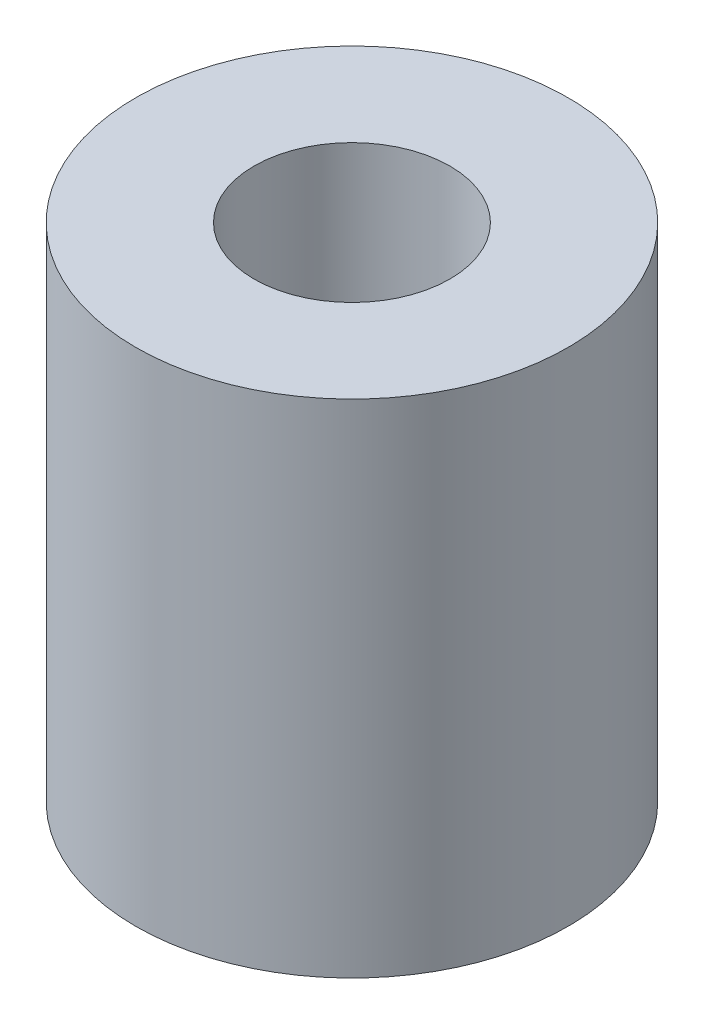
ISO-10303-21;
HEADER;
FILE_DESCRIPTION(('STEP AP214'),'2;1');
FILE_NAME('part.step','',(''),(''),'','','');
FILE_SCHEMA(('AUTOMOTIVE_DESIGN { 1 0 10303 214 1 1 1 1 }'));
ENDSEC;
DATA;
#1=APPLICATION_CONTEXT('core data for automotive mechanical design processes');
#2=APPLICATION_PROTOCOL_DEFINITION('international standard','automotive_design',2000,#1);
#3=PRODUCT_CONTEXT('',#1,'mechanical');
#4=PRODUCT('Part','Part','',(#3));
#5=PRODUCT_RELATED_PRODUCT_CATEGORY('part','',(#4));
#6=PRODUCT_DEFINITION_FORMATION('','',#4);
#7=PRODUCT_DEFINITION_CONTEXT('part definition',#1,'design');
#8=PRODUCT_DEFINITION('design','',#6,#7);
#9=PRODUCT_DEFINITION_SHAPE('','',#8);
#10=(LENGTH_UNIT() NAMED_UNIT(*) SI_UNIT(.MILLI.,.METRE.));
#11=(NAMED_UNIT(*) PLANE_ANGLE_UNIT() SI_UNIT($,.RADIAN.));
#12=(NAMED_UNIT(*) SI_UNIT($,.STERADIAN.) SOLID_ANGLE_UNIT());
#13=UNCERTAINTY_MEASURE_WITH_UNIT(LENGTH_MEASURE(1.E-05),#10,'distance_accuracy_value','');
#14=(GEOMETRIC_REPRESENTATION_CONTEXT(3) GLOBAL_UNCERTAINTY_ASSIGNED_CONTEXT((#13)) GLOBAL_UNIT_ASSIGNED_CONTEXT((#10,
#11,#12)) REPRESENTATION_CONTEXT('',''));
#15=CARTESIAN_POINT('',(0.,0.,0.));
#16=DIRECTION('',(0.,0.,1.));
#17=DIRECTION('',(1.,0.,0.));
#18=AXIS2_PLACEMENT_3D('',#15,#16,#17);
#19=CARTESIAN_POINT('',(0.,16.,0.));
#20=DIRECTION('',(0.,-1.,0.));
#21=DIRECTION('',(0.,0.,-1.));
#22=AXIS2_PLACEMENT_3D('',#19,#20,#21);
#23=CYLINDRICAL_SURFACE('',#22,6.9);
#24=CARTESIAN_POINT('',(0.,16.,0.));
#25=DIRECTION('',(0.,1.,0.));
#26=DIRECTION('',(0.,0.,1.));
#27=AXIS2_PLACEMENT_3D('',#24,#25,#26);
#28=CIRCLE('',#27,6.9);
#29=CARTESIAN_POINT('',(0.,16.,6.9));
#30=VERTEX_POINT('',#29);
#31=EDGE_CURVE('E11',#30,#30,#28,.T.);
#32=ORIENTED_EDGE('',*,*,#31,.F.);
#33=EDGE_LOOP('',(#32));
#34=FACE_BOUND('',#33,.T.);
#35=CARTESIAN_POINT('',(0.,0.,0.));
#36=DIRECTION('',(0.,1.,0.));
#37=DIRECTION('',(0.,0.,1.));
#38=AXIS2_PLACEMENT_3D('',#35,#36,#37);
#39=CIRCLE('',#38,6.9);
#40=CARTESIAN_POINT('',(0.,0.,6.9));
#41=VERTEX_POINT('',#40);
#42=EDGE_CURVE('E38',#41,#41,#39,.T.);
#43=ORIENTED_EDGE('',*,*,#42,.T.);
#44=EDGE_LOOP('',(#43));
#45=FACE_BOUND('',#44,.T.);
#46=ADVANCED_FACE('F35',(#34,#45),#23,.T.);
#47=CARTESIAN_POINT('',(0.,16.,0.));
#48=DIRECTION('',(0.,1.,0.));
#49=DIRECTION('',(0.,0.,1.));
#50=AXIS2_PLACEMENT_3D('',#47,#48,#49);
#51=PLANE('',#50);
#52=CARTESIAN_POINT('',(0.,16.,0.));
#53=DIRECTION('',(0.,1.,0.));
#54=DIRECTION('',(0.,0.,1.));
#55=AXIS2_PLACEMENT_3D('',#52,#53,#54);
#56=CIRCLE('',#55,3.125);
#57=CARTESIAN_POINT('',(0.,16.,3.125));
#58=VERTEX_POINT('',#57);
#59=EDGE_CURVE('E49',#58,#58,#56,.T.);
#60=ORIENTED_EDGE('',*,*,#59,.F.);
#61=EDGE_LOOP('',(#60));
#62=FACE_BOUND('',#61,.T.);
#63=ORIENTED_EDGE('',*,*,#31,.T.);
#64=EDGE_LOOP('',(#63));
#65=FACE_BOUND('',#64,.T.);
#66=ADVANCED_FACE('F55',(#62,#65),#51,.T.);
#67=CARTESIAN_POINT('',(0.,0.,0.));
#68=DIRECTION('',(0.,1.,0.));
#69=DIRECTION('',(0.,0.,1.));
#70=AXIS2_PLACEMENT_3D('',#67,#68,#69);
#71=PLANE('',#70);
#72=ORIENTED_EDGE('',*,*,#42,.F.);
#73=EDGE_LOOP('',(#72));
#74=FACE_BOUND('',#73,.T.);
#75=ADVANCED_FACE('F57',(#74),#71,.F.);
#76=CARTESIAN_POINT('',(0.,-8.83883476483185,0.));
#77=DIRECTION('',(0.,1.,0.));
#78=DIRECTION('',(0.,0.,1.));
#79=AXIS2_PLACEMENT_3D('',#76,#77,#78);
#80=CYLINDRICAL_SURFACE('',#79,3.125);
#81=CARTESIAN_POINT('',(0.,2.,0.));
#82=DIRECTION('',(0.,1.,0.));
#83=DIRECTION('',(0.,0.,1.));
#84=AXIS2_PLACEMENT_3D('',#81,#82,#83);
#85=CIRCLE('',#84,3.125);
#86=CARTESIAN_POINT('',(0.,2.,3.125));
#87=VERTEX_POINT('',#86);
#88=EDGE_CURVE('E45',#87,#87,#85,.F.);
#89=ORIENTED_EDGE('',*,*,#88,.T.);
#90=EDGE_LOOP('',(#89));
#91=FACE_BOUND('',#90,.T.);
#92=ORIENTED_EDGE('',*,*,#59,.T.);
#93=EDGE_LOOP('',(#92));
#94=FACE_BOUND('',#93,.T.);
#95=ADVANCED_FACE('F53',(#91,#94),#80,.F.);
#96=CARTESIAN_POINT('',(0.,2.,0.));
#97=DIRECTION('',(0.,1.,0.));
#98=DIRECTION('',(0.,0.,1.));
#99=AXIS2_PLACEMENT_3D('',#96,#97,#98);
#100=PLANE('',#99);
#101=ORIENTED_EDGE('',*,*,#88,.F.);
#102=EDGE_LOOP('',(#101));
#103=FACE_BOUND('',#102,.T.);
#104=ADVANCED_FACE('F68',(#103),#100,.T.);
#105=CLOSED_SHELL('',(#46,#66,#75,#95,#104));
#106=MANIFOLD_SOLID_BREP('B2',#105);
#107=ADVANCED_BREP_SHAPE_REPRESENTATION('',(#18,#106),#14);
#108=SHAPE_DEFINITION_REPRESENTATION(#9,#107);
ENDSEC;
END-ISO-10303-21;
